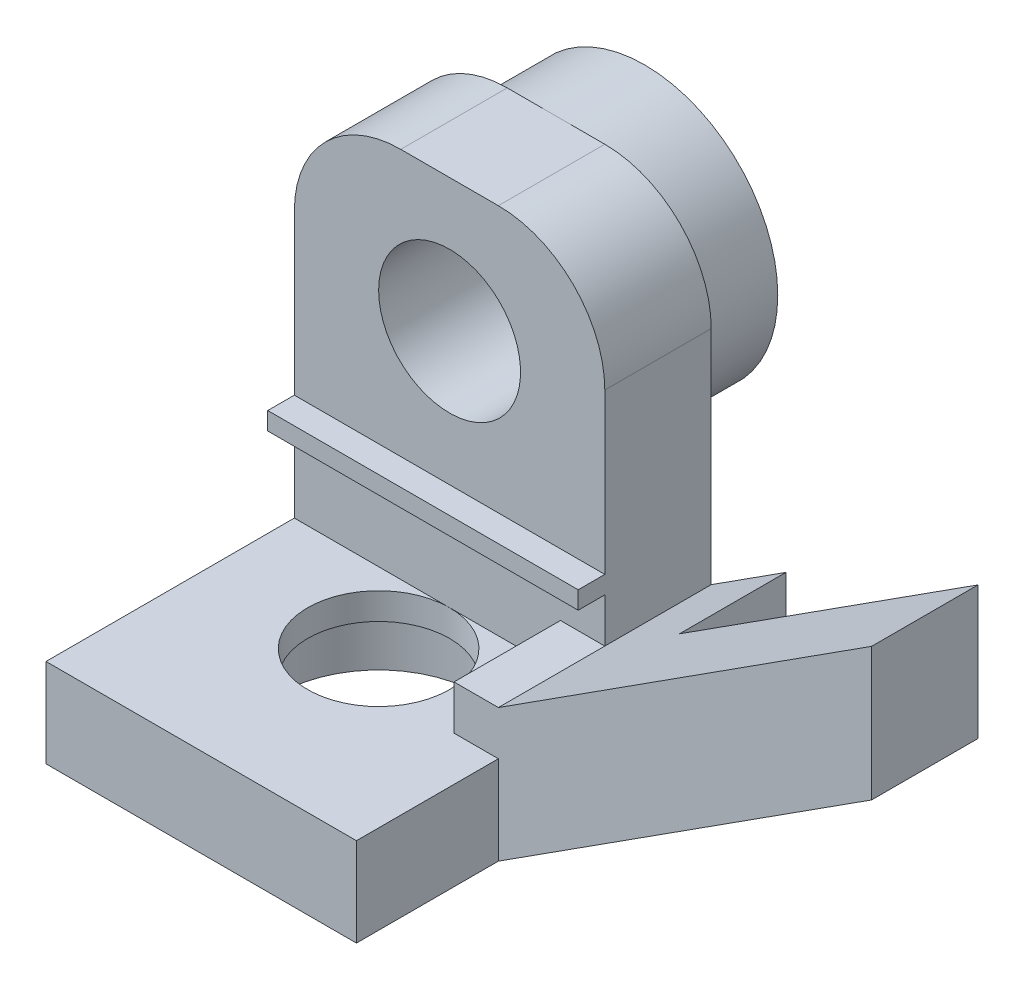
ISO-10303-21;
HEADER;
FILE_DESCRIPTION(('STEP AP214'),'2;1');
FILE_NAME('part.step','',(''),(''),'','','');
FILE_SCHEMA(('AUTOMOTIVE_DESIGN { 1 0 10303 214 1 1 1 1 }'));
ENDSEC;
DATA;
#1=APPLICATION_CONTEXT('core data for automotive mechanical design processes');
#2=APPLICATION_PROTOCOL_DEFINITION('international standard','automotive_design',2000,#1);
#3=PRODUCT_CONTEXT('',#1,'mechanical');
#4=PRODUCT('Part','Part','',(#3));
#5=PRODUCT_RELATED_PRODUCT_CATEGORY('part','',(#4));
#6=PRODUCT_DEFINITION_FORMATION('','',#4);
#7=PRODUCT_DEFINITION_CONTEXT('part definition',#1,'design');
#8=PRODUCT_DEFINITION('design','',#6,#7);
#9=PRODUCT_DEFINITION_SHAPE('','',#8);
#10=(LENGTH_UNIT() NAMED_UNIT(*) SI_UNIT(.MILLI.,.METRE.));
#11=(NAMED_UNIT(*) PLANE_ANGLE_UNIT() SI_UNIT($,.RADIAN.));
#12=(NAMED_UNIT(*) SI_UNIT($,.STERADIAN.) SOLID_ANGLE_UNIT());
#13=UNCERTAINTY_MEASURE_WITH_UNIT(LENGTH_MEASURE(1.E-05),#10,'distance_accuracy_value','');
#14=(GEOMETRIC_REPRESENTATION_CONTEXT(3) GLOBAL_UNCERTAINTY_ASSIGNED_CONTEXT((#13)) GLOBAL_UNIT_ASSIGNED_CONTEXT((#10,
#11,#12)) REPRESENTATION_CONTEXT('',''));
#15=CARTESIAN_POINT('',(0.,0.,0.));
#16=DIRECTION('',(0.,0.,1.));
#17=DIRECTION('',(1.,0.,0.));
#18=AXIS2_PLACEMENT_3D('',#15,#16,#17);
#19=CARTESIAN_POINT('',(-17.5,-12.,6.));
#20=DIRECTION('',(0.,0.,-1.));
#21=DIRECTION('',(-1.,0.,0.));
#22=AXIS2_PLACEMENT_3D('',#19,#20,#21);
#23=PLANE('',#22);
#24=DIRECTION('',(1.,0.,0.));
#25=VECTOR('',#24,1.);
#26=CARTESIAN_POINT('',(12.5,-6.99999999999999,6.));
#27=LINE('',#26,#25);
#28=CARTESIAN_POINT('',(12.5,-6.99999999999999,6.));
#29=VERTEX_POINT('',#28);
#30=CARTESIAN_POINT('',(17.5,-6.99999999999998,6.));
#31=VERTEX_POINT('',#30);
#32=EDGE_CURVE('E513',#29,#31,#27,.T.);
#33=ORIENTED_EDGE('',*,*,#32,.T.);
#34=DIRECTION('',(0.,1.,0.));
#35=VECTOR('',#34,1.);
#36=CARTESIAN_POINT('',(17.5,-12.,6.));
#37=LINE('',#36,#35);
#38=CARTESIAN_POINT('',(17.5,-2.,6.));
#39=VERTEX_POINT('',#38);
#40=EDGE_CURVE('E64',#31,#39,#37,.T.);
#41=ORIENTED_EDGE('',*,*,#40,.T.);
#42=DIRECTION('',(-1.,0.,0.));
#43=VECTOR('',#42,1.);
#44=CARTESIAN_POINT('',(-17.5,-2.,6.));
#45=LINE('',#44,#43);
#46=CARTESIAN_POINT('',(-17.5,-2.,6.));
#47=VERTEX_POINT('',#46);
#48=EDGE_CURVE('E213',#39,#47,#45,.T.);
#49=ORIENTED_EDGE('',*,*,#48,.T.);
#50=DIRECTION('',(0.,1.,0.));
#51=VECTOR('',#50,1.);
#52=CARTESIAN_POINT('',(-17.5,-12.,6.));
#53=LINE('',#52,#51);
#54=CARTESIAN_POINT('',(-17.5,-12.,6.));
#55=VERTEX_POINT('',#54);
#56=EDGE_CURVE('E207',#55,#47,#53,.T.);
#57=ORIENTED_EDGE('',*,*,#56,.F.);
#58=DIRECTION('',(-1.,0.,0.));
#59=VECTOR('',#58,1.);
#60=CARTESIAN_POINT('',(-17.5,-12.,6.));
#61=LINE('',#60,#59);
#62=CARTESIAN_POINT('',(0.,-12.,6.));
#63=VERTEX_POINT('',#62);
#64=EDGE_CURVE('E205',#63,#55,#61,.T.);
#65=ORIENTED_EDGE('',*,*,#64,.F.);
#66=CARTESIAN_POINT('',(12.5,-12.,6.));
#67=VERTEX_POINT('',#66);
#68=EDGE_CURVE('E56',#67,#63,#61,.T.);
#69=ORIENTED_EDGE('',*,*,#68,.F.);
#70=DIRECTION('',(0.,-1.,0.));
#71=VECTOR('',#70,1.);
#72=CARTESIAN_POINT('',(12.5,-6.99999999999999,6.));
#73=LINE('',#72,#71);
#74=EDGE_CURVE('E187',#29,#67,#73,.T.);
#75=ORIENTED_EDGE('',*,*,#74,.F.);
#76=EDGE_LOOP('',(#33,#41,#49,#57,#65,#69,#75));
#77=FACE_BOUND('',#76,.T.);
#78=ADVANCED_FACE('F39',(#77),#23,.F.);
#79=CARTESIAN_POINT('',(0.,-12.,0.));
#80=DIRECTION('',(0.,1.,0.));
#81=DIRECTION('',(0.,0.,1.));
#82=AXIS2_PLACEMENT_3D('',#79,#80,#81);
#83=PLANE('',#82);
#84=DIRECTION('',(0.,0.,1.));
#85=VECTOR('',#84,1.);
#86=CARTESIAN_POINT('',(17.5,-12.,-6.));
#87=LINE('',#86,#85);
#88=CARTESIAN_POINT('',(17.5,-12.,18.));
#89=VERTEX_POINT('',#88);
#90=CARTESIAN_POINT('',(17.5,-12.,34.));
#91=VERTEX_POINT('',#90);
#92=EDGE_CURVE('E404',#89,#91,#87,.T.);
#93=ORIENTED_EDGE('',*,*,#92,.F.);
#94=DIRECTION('',(1.,0.,0.));
#95=VECTOR('',#94,1.);
#96=CARTESIAN_POINT('',(12.5,-12.,18.));
#97=LINE('',#96,#95);
#98=CARTESIAN_POINT('',(12.5,-12.,18.));
#99=VERTEX_POINT('',#98);
#100=EDGE_CURVE('E199',#99,#89,#97,.T.);
#101=ORIENTED_EDGE('',*,*,#100,.F.);
#102=DIRECTION('',(0.,0.,1.));
#103=VECTOR('',#102,1.);
#104=CARTESIAN_POINT('',(12.5,-12.,6.));
#105=LINE('',#104,#103);
#106=EDGE_CURVE('E189',#67,#99,#105,.T.);
#107=ORIENTED_EDGE('',*,*,#106,.F.);
#108=ORIENTED_EDGE('',*,*,#68,.T.);
#109=CARTESIAN_POINT('',(0.,-12.,14.));
#110=DIRECTION('',(0.,-1.,0.));
#111=DIRECTION('',(0.,0.,-1.));
#112=AXIS2_PLACEMENT_3D('',#109,#110,#111);
#113=CIRCLE('',#112,8.);
#114=EDGE_CURVE('E441',#63,#63,#113,.T.);
#115=ORIENTED_EDGE('',*,*,#114,.T.);
#116=ORIENTED_EDGE('',*,*,#64,.T.);
#117=DIRECTION('',(0.,0.,-1.));
#118=VECTOR('',#117,1.);
#119=CARTESIAN_POINT('',(-17.5,-12.,-6.));
#120=LINE('',#119,#118);
#121=CARTESIAN_POINT('',(-17.5,-12.,34.));
#122=VERTEX_POINT('',#121);
#123=EDGE_CURVE('E398',#122,#55,#120,.T.);
#124=ORIENTED_EDGE('',*,*,#123,.F.);
#125=DIRECTION('',(-1.,0.,0.));
#126=VECTOR('',#125,1.);
#127=CARTESIAN_POINT('',(-17.5,-12.,34.));
#128=LINE('',#127,#126);
#129=EDGE_CURVE('E409',#91,#122,#128,.T.);
#130=ORIENTED_EDGE('',*,*,#129,.F.);
#131=EDGE_LOOP('',(#93,#101,#107,#108,#115,#116,#124,#130));
#132=FACE_BOUND('',#131,.T.);
#133=ADVANCED_FACE('F198',(#132),#83,.T.);
#134=CARTESIAN_POINT('',(17.5,20.,-6.));
#135=DIRECTION('',(-1.,0.,0.));
#136=DIRECTION('',(0.,0.,1.));
#137=AXIS2_PLACEMENT_3D('',#134,#135,#136);
#138=PLANE('',#137);
#139=DIRECTION('',(0.,-1.,0.));
#140=VECTOR('',#139,1.);
#141=CARTESIAN_POINT('',(17.5,-22.,18.));
#142=LINE('',#141,#140);
#143=CARTESIAN_POINT('',(17.5,-22.,18.));
#144=VERTEX_POINT('',#143);
#145=EDGE_CURVE('E485',#89,#144,#142,.T.);
#146=ORIENTED_EDGE('',*,*,#145,.F.);
#147=ORIENTED_EDGE('',*,*,#92,.T.);
#148=DIRECTION('',(0.,1.,0.));
#149=VECTOR('',#148,1.);
#150=CARTESIAN_POINT('',(17.5,-22.,34.));
#151=LINE('',#150,#149);
#152=CARTESIAN_POINT('',(17.5,-22.,34.));
#153=VERTEX_POINT('',#152);
#154=EDGE_CURVE('E216',#153,#91,#151,.T.);
#155=ORIENTED_EDGE('',*,*,#154,.F.);
#156=DIRECTION('',(0.,0.,1.));
#157=VECTOR('',#156,1.);
#158=CARTESIAN_POINT('',(17.5,-22.,-6.));
#159=LINE('',#158,#157);
#160=EDGE_CURVE('E429',#144,#153,#159,.T.);
#161=ORIENTED_EDGE('',*,*,#160,.F.);
#162=EDGE_LOOP('',(#146,#147,#155,#161));
#163=FACE_BOUND('',#162,.T.);
#164=ADVANCED_FACE('F364',(#163),#138,.F.);
#165=ORIENTED_EDGE('',*,*,#40,.F.);
#166=DIRECTION('',(0.,0.,-1.));
#167=VECTOR('',#166,1.);
#168=CARTESIAN_POINT('',(17.5,-7.,6.));
#169=LINE('',#168,#167);
#170=CARTESIAN_POINT('',(17.5,-7.,-6.));
#171=VERTEX_POINT('',#170);
#172=EDGE_CURVE('E450',#31,#171,#169,.T.);
#173=ORIENTED_EDGE('',*,*,#172,.T.);
#174=DIRECTION('',(0.,-1.,0.));
#175=VECTOR('',#174,1.);
#176=CARTESIAN_POINT('',(17.5,20.,-6.));
#177=LINE('',#176,#175);
#178=CARTESIAN_POINT('',(17.5,18.,-6.));
#179=VERTEX_POINT('',#178);
#180=EDGE_CURVE('E293',#179,#171,#177,.T.);
#181=ORIENTED_EDGE('',*,*,#180,.F.);
#182=DIRECTION('',(0.,0.,-1.));
#183=VECTOR('',#182,1.);
#184=CARTESIAN_POINT('',(17.5,18.,6.));
#185=LINE('',#184,#183);
#186=CARTESIAN_POINT('',(17.5,18.,6.));
#187=VERTEX_POINT('',#186);
#188=EDGE_CURVE('E43',#179,#187,#185,.F.);
#189=ORIENTED_EDGE('',*,*,#188,.T.);
#190=DIRECTION('',(0.,-1.,0.));
#191=VECTOR('',#190,1.);
#192=CARTESIAN_POINT('',(17.5,20.,6.));
#193=LINE('',#192,#191);
#194=CARTESIAN_POINT('',(17.5,0.,6.));
#195=VERTEX_POINT('',#194);
#196=EDGE_CURVE('E282',#187,#195,#193,.T.);
#197=ORIENTED_EDGE('',*,*,#196,.T.);
#198=DIRECTION('',(0.,0.,1.));
#199=VECTOR('',#198,1.);
#200=CARTESIAN_POINT('',(17.5,0.,-6.));
#201=LINE('',#200,#199);
#202=CARTESIAN_POINT('',(17.5,0.,9.));
#203=VERTEX_POINT('',#202);
#204=EDGE_CURVE('E237',#195,#203,#201,.T.);
#205=ORIENTED_EDGE('',*,*,#204,.T.);
#206=DIRECTION('',(0.,1.,0.));
#207=VECTOR('',#206,1.);
#208=CARTESIAN_POINT('',(17.5,-2.,9.));
#209=LINE('',#208,#207);
#210=CARTESIAN_POINT('',(17.5,-2.,9.));
#211=VERTEX_POINT('',#210);
#212=EDGE_CURVE('E245',#211,#203,#209,.T.);
#213=ORIENTED_EDGE('',*,*,#212,.F.);
#214=DIRECTION('',(0.,0.,1.));
#215=VECTOR('',#214,1.);
#216=CARTESIAN_POINT('',(17.5,-2.,-6.));
#217=LINE('',#216,#215);
#218=EDGE_CURVE('E226',#39,#211,#217,.T.);
#219=ORIENTED_EDGE('',*,*,#218,.F.);
#220=EDGE_LOOP('',(#165,#173,#181,#189,#197,#205,#213,#219));
#221=FACE_BOUND('',#220,.T.);
#222=ADVANCED_FACE('F329',(#221),#138,.F.);
#223=CARTESIAN_POINT('',(0.,-2.,0.));
#224=DIRECTION('',(0.,1.,0.));
#225=DIRECTION('',(0.,0.,1.));
#226=AXIS2_PLACEMENT_3D('',#223,#224,#225);
#227=PLANE('',#226);
#228=ORIENTED_EDGE('',*,*,#48,.F.);
#229=ORIENTED_EDGE('',*,*,#218,.T.);
#230=DIRECTION('',(-1.,0.,0.));
#231=VECTOR('',#230,1.);
#232=CARTESIAN_POINT('',(-17.5,-2.,9.));
#233=LINE('',#232,#231);
#234=CARTESIAN_POINT('',(-17.5,-2.,9.));
#235=VERTEX_POINT('',#234);
#236=EDGE_CURVE('E230',#211,#235,#233,.T.);
#237=ORIENTED_EDGE('',*,*,#236,.T.);
#238=DIRECTION('',(0.,0.,-1.));
#239=VECTOR('',#238,1.);
#240=CARTESIAN_POINT('',(-17.5,-2.,-6.));
#241=LINE('',#240,#239);
#242=EDGE_CURVE('E223',#235,#47,#241,.T.);
#243=ORIENTED_EDGE('',*,*,#242,.T.);
#244=EDGE_LOOP('',(#228,#229,#237,#243));
#245=FACE_BOUND('',#244,.T.);
#246=ADVANCED_FACE('F369',(#245),#227,.F.);
#247=CARTESIAN_POINT('',(-17.5,20.,-6.));
#248=DIRECTION('',(0.,0.,1.));
#249=DIRECTION('',(1.,0.,0.));
#250=AXIS2_PLACEMENT_3D('',#247,#248,#249);
#251=PLANE('',#250);
#252=CARTESIAN_POINT('',(0.,15.,-6.));
#253=DIRECTION('',(0.,0.,-1.));
#254=DIRECTION('',(-1.,0.,0.));
#255=AXIS2_PLACEMENT_3D('',#252,#253,#254);
#256=CIRCLE('',#255,8.);
#257=CARTESIAN_POINT('',(-8.00000000000001,15.,-6.));
#258=VERTEX_POINT('',#257);
#259=EDGE_CURVE('E260',#258,#258,#256,.T.);
#260=ORIENTED_EDGE('',*,*,#259,.F.);
#261=EDGE_LOOP('',(#260));
#262=FACE_BOUND('',#261,.T.);
#263=CARTESIAN_POINT('',(0.,15.,-6.));
#264=DIRECTION('',(0.,0.,-1.));
#265=DIRECTION('',(-1.,0.,0.));
#266=AXIS2_PLACEMENT_3D('',#263,#264,#265);
#267=CIRCLE('',#266,12.);
#268=CARTESIAN_POINT('',(-12.,15.,-6.));
#269=VERTEX_POINT('',#268);
#270=EDGE_CURVE('E249',#269,#269,#267,.T.);
#271=ORIENTED_EDGE('',*,*,#270,.T.);
#272=EDGE_LOOP('',(#271));
#273=FACE_BOUND('',#272,.T.);
#274=ADVANCED_FACE('F372',(#262,#273),#251,.F.);
#275=CARTESIAN_POINT('',(0.,15.,-6.));
#276=DIRECTION('',(0.,0.,-1.));
#277=DIRECTION('',(-1.,0.,0.));
#278=AXIS2_PLACEMENT_3D('',#275,#276,#277);
#279=CIRCLE('',#278,15.);
#280=CARTESIAN_POINT('',(0.,30.,-6.));
#281=VERTEX_POINT('',#280);
#282=EDGE_CURVE('E11',#281,#281,#279,.T.);
#283=ORIENTED_EDGE('',*,*,#282,.F.);
#284=DIRECTION('',(-1.,0.,0.));
#285=VECTOR('',#284,1.);
#286=CARTESIAN_POINT('',(-17.5,30.,-6.));
#287=LINE('',#286,#285);
#288=CARTESIAN_POINT('',(5.49999999999999,30.,-6.));
#289=VERTEX_POINT('',#288);
#290=EDGE_CURVE('E274',#289,#281,#287,.T.);
#291=ORIENTED_EDGE('',*,*,#290,.F.);
#292=CARTESIAN_POINT('',(5.49999999999999,18.,-6.));
#293=DIRECTION('',(0.,0.,1.));
#294=DIRECTION('',(1.,0.,0.));
#295=AXIS2_PLACEMENT_3D('',#292,#293,#294);
#296=CIRCLE('',#295,12.);
#297=EDGE_CURVE('E314',#289,#179,#296,.F.);
#298=ORIENTED_EDGE('',*,*,#297,.T.);
#299=ORIENTED_EDGE('',*,*,#180,.T.);
#300=DIRECTION('',(0.84151078194531,0.54024032047765,0.));
#301=VECTOR('',#300,1.);
#302=CARTESIAN_POINT('',(25.9151078194531,-1.5975967952235,-6.));
#303=LINE('',#302,#301);
#304=CARTESIAN_POINT('',(25.9151078194531,-1.5975967952235,-6.));
#305=VERTEX_POINT('',#304);
#306=EDGE_CURVE('E467',#171,#305,#303,.T.);
#307=ORIENTED_EDGE('',*,*,#306,.T.);
#308=DIRECTION('',(0.,-1.,0.));
#309=VECTOR('',#308,1.);
#310=CARTESIAN_POINT('',(25.9151078194531,-16.5975967952235,-6.));
#311=LINE('',#310,#309);
#312=CARTESIAN_POINT('',(25.9151078194531,-16.5975967952235,-6.));
#313=VERTEX_POINT('',#312);
#314=EDGE_CURVE('E463',#305,#313,#311,.T.);
#315=ORIENTED_EDGE('',*,*,#314,.T.);
#316=DIRECTION('',(-0.841510781945309,-0.54024032047765,0.));
#317=VECTOR('',#316,1.);
#318=CARTESIAN_POINT('',(17.5,-22.,-6.));
#319=LINE('',#318,#317);
#320=CARTESIAN_POINT('',(17.5,-22.,-6.));
#321=VERTEX_POINT('',#320);
#322=EDGE_CURVE('E459',#313,#321,#319,.T.);
#323=ORIENTED_EDGE('',*,*,#322,.T.);
#324=DIRECTION('',(1.,0.,0.));
#325=VECTOR('',#324,1.);
#326=CARTESIAN_POINT('',(-17.5,-22.,-6.));
#327=LINE('',#326,#325);
#328=CARTESIAN_POINT('',(-17.5,-22.,-6.));
#329=VERTEX_POINT('',#328);
#330=EDGE_CURVE('E433',#329,#321,#327,.T.);
#331=ORIENTED_EDGE('',*,*,#330,.F.);
#332=DIRECTION('',(0.,-1.,0.));
#333=VECTOR('',#332,1.);
#334=CARTESIAN_POINT('',(-17.5,20.,-6.));
#335=LINE('',#334,#333);
#336=CARTESIAN_POINT('',(-17.5,18.,-6.));
#337=VERTEX_POINT('',#336);
#338=EDGE_CURVE('E290',#337,#329,#335,.T.);
#339=ORIENTED_EDGE('',*,*,#338,.F.);
#340=CARTESIAN_POINT('',(-5.50000000000001,18.,-6.));
#341=DIRECTION('',(0.,0.,1.));
#342=DIRECTION('',(1.,0.,0.));
#343=AXIS2_PLACEMENT_3D('',#340,#341,#342);
#344=CIRCLE('',#343,12.);
#345=CARTESIAN_POINT('',(-5.50000000000001,30.,-6.));
#346=VERTEX_POINT('',#345);
#347=EDGE_CURVE('E316',#337,#346,#344,.F.);
#348=ORIENTED_EDGE('',*,*,#347,.T.);
#349=EDGE_CURVE('E273',#281,#346,#287,.T.);
#350=ORIENTED_EDGE('',*,*,#349,.F.);
#351=EDGE_LOOP('',(#283,#291,#298,#299,#307,#315,#323,#331,#339,#348,#350));
#352=FACE_BOUND('',#351,.T.);
#353=ADVANCED_FACE('F340',(#352),#251,.F.);
#354=CARTESIAN_POINT('',(-17.5,20.,-6.));
#355=DIRECTION('',(1.,0.,0.));
#356=DIRECTION('',(0.,0.,-1.));
#357=AXIS2_PLACEMENT_3D('',#354,#355,#356);
#358=PLANE('',#357);
#359=DIRECTION('',(0.,-1.,0.));
#360=VECTOR('',#359,1.);
#361=CARTESIAN_POINT('',(-17.5,20.,6.));
#362=LINE('',#361,#360);
#363=CARTESIAN_POINT('',(-17.5,18.,6.));
#364=VERTEX_POINT('',#363);
#365=CARTESIAN_POINT('',(-17.5,0.,6.));
#366=VERTEX_POINT('',#365);
#367=EDGE_CURVE('E286',#364,#366,#362,.T.);
#368=ORIENTED_EDGE('',*,*,#367,.F.);
#369=DIRECTION('',(0.,0.,1.));
#370=VECTOR('',#369,1.);
#371=CARTESIAN_POINT('',(-17.5,18.,-6.));
#372=LINE('',#371,#370);
#373=EDGE_CURVE('E311',#364,#337,#372,.F.);
#374=ORIENTED_EDGE('',*,*,#373,.T.);
#375=ORIENTED_EDGE('',*,*,#338,.T.);
#376=DIRECTION('',(0.,0.,-1.));
#377=VECTOR('',#376,1.);
#378=CARTESIAN_POINT('',(-17.5,-22.,-6.));
#379=LINE('',#378,#377);
#380=CARTESIAN_POINT('',(-17.5,-22.,34.));
#381=VERTEX_POINT('',#380);
#382=EDGE_CURVE('E419',#381,#329,#379,.T.);
#383=ORIENTED_EDGE('',*,*,#382,.F.);
#384=DIRECTION('',(0.,1.,0.));
#385=VECTOR('',#384,1.);
#386=CARTESIAN_POINT('',(-17.5,-22.,34.));
#387=LINE('',#386,#385);
#388=EDGE_CURVE('E401',#381,#122,#387,.T.);
#389=ORIENTED_EDGE('',*,*,#388,.T.);
#390=ORIENTED_EDGE('',*,*,#123,.T.);
#391=ORIENTED_EDGE('',*,*,#56,.T.);
#392=ORIENTED_EDGE('',*,*,#242,.F.);
#393=DIRECTION('',(0.,1.,0.));
#394=VECTOR('',#393,1.);
#395=CARTESIAN_POINT('',(-17.5,-2.,9.));
#396=LINE('',#395,#394);
#397=CARTESIAN_POINT('',(-17.5,0.,9.));
#398=VERTEX_POINT('',#397);
#399=EDGE_CURVE('E233',#235,#398,#396,.T.);
#400=ORIENTED_EDGE('',*,*,#399,.T.);
#401=DIRECTION('',(0.,0.,-1.));
#402=VECTOR('',#401,1.);
#403=CARTESIAN_POINT('',(-17.5,0.,-6.));
#404=LINE('',#403,#402);
#405=EDGE_CURVE('E222',#398,#366,#404,.T.);
#406=ORIENTED_EDGE('',*,*,#405,.T.);
#407=EDGE_LOOP('',(#368,#374,#375,#383,#389,#390,#391,#392,#400,#406));
#408=FACE_BOUND('',#407,.T.);
#409=ADVANCED_FACE('F393',(#408),#358,.F.);
#410=CARTESIAN_POINT('',(-17.5,20.,6.));
#411=DIRECTION('',(0.,0.,-1.));
#412=DIRECTION('',(-1.,0.,0.));
#413=AXIS2_PLACEMENT_3D('',#410,#411,#412);
#414=PLANE('',#413);
#415=CARTESIAN_POINT('',(0.,15.,6.));
#416=DIRECTION('',(0.,0.,-1.));
#417=DIRECTION('',(-1.,0.,0.));
#418=AXIS2_PLACEMENT_3D('',#415,#416,#417);
#419=CIRCLE('',#418,8.);
#420=CARTESIAN_POINT('',(-8.00000000000001,15.,6.));
#421=VERTEX_POINT('',#420);
#422=EDGE_CURVE('E262',#421,#421,#419,.T.);
#423=ORIENTED_EDGE('',*,*,#422,.T.);
#424=EDGE_LOOP('',(#423));
#425=FACE_BOUND('',#424,.T.);
#426=DIRECTION('',(1.,0.,0.));
#427=VECTOR('',#426,1.);
#428=CARTESIAN_POINT('',(-17.5,30.,6.));
#429=LINE('',#428,#427);
#430=CARTESIAN_POINT('',(-5.5,30.,6.));
#431=VERTEX_POINT('',#430);
#432=CARTESIAN_POINT('',(5.49999999999999,30.,6.));
#433=VERTEX_POINT('',#432);
#434=EDGE_CURVE('E266',#431,#433,#429,.T.);
#435=ORIENTED_EDGE('',*,*,#434,.F.);
#436=CARTESIAN_POINT('',(-5.5,18.,6.));
#437=DIRECTION('',(0.,0.,-1.));
#438=DIRECTION('',(-1.,0.,0.));
#439=AXIS2_PLACEMENT_3D('',#436,#437,#438);
#440=CIRCLE('',#439,12.);
#441=EDGE_CURVE('E308',#431,#364,#440,.F.);
#442=ORIENTED_EDGE('',*,*,#441,.T.);
#443=ORIENTED_EDGE('',*,*,#367,.T.);
#444=DIRECTION('',(1.,0.,0.));
#445=VECTOR('',#444,1.);
#446=CARTESIAN_POINT('',(-17.5,0.,6.));
#447=LINE('',#446,#445);
#448=EDGE_CURVE('E278',#366,#195,#447,.T.);
#449=ORIENTED_EDGE('',*,*,#448,.T.);
#450=ORIENTED_EDGE('',*,*,#196,.F.);
#451=CARTESIAN_POINT('',(5.49999999999999,18.,6.));
#452=DIRECTION('',(0.,0.,-1.));
#453=DIRECTION('',(-1.,0.,0.));
#454=AXIS2_PLACEMENT_3D('',#451,#452,#453);
#455=CIRCLE('',#454,12.);
#456=EDGE_CURVE('E305',#187,#433,#455,.F.);
#457=ORIENTED_EDGE('',*,*,#456,.T.);
#458=EDGE_LOOP('',(#435,#442,#443,#449,#450,#457));
#459=FACE_BOUND('',#458,.T.);
#460=ADVANCED_FACE('F335',(#425,#459),#414,.F.);
#461=CARTESIAN_POINT('',(0.,30.,0.));
#462=DIRECTION('',(0.,1.,0.));
#463=DIRECTION('',(0.,0.,1.));
#464=AXIS2_PLACEMENT_3D('',#461,#462,#463);
#465=PLANE('',#464);
#466=ORIENTED_EDGE('',*,*,#290,.T.);
#467=ORIENTED_EDGE('',*,*,#349,.T.);
#468=DIRECTION('',(0.,0.,1.));
#469=VECTOR('',#468,1.);
#470=CARTESIAN_POINT('',(-5.5,30.,5.99999999999999));
#471=LINE('',#470,#469);
#472=EDGE_CURVE('E301',#346,#431,#471,.T.);
#473=ORIENTED_EDGE('',*,*,#472,.T.);
#474=ORIENTED_EDGE('',*,*,#434,.T.);
#475=DIRECTION('',(0.,0.,-1.));
#476=VECTOR('',#475,1.);
#477=CARTESIAN_POINT('',(5.49999999999999,30.,-6.));
#478=LINE('',#477,#476);
#479=EDGE_CURVE('E297',#433,#289,#478,.T.);
#480=ORIENTED_EDGE('',*,*,#479,.T.);
#481=EDGE_LOOP('',(#466,#467,#473,#474,#480));
#482=FACE_BOUND('',#481,.T.);
#483=ADVANCED_FACE('F339',(#482),#465,.T.);
#484=CARTESIAN_POINT('',(0.,15.,6.));
#485=DIRECTION('',(0.,0.,-1.));
#486=DIRECTION('',(-1.,0.,0.));
#487=AXIS2_PLACEMENT_3D('',#484,#485,#486);
#488=CYLINDRICAL_SURFACE('',#487,8.);
#489=ORIENTED_EDGE('',*,*,#422,.F.);
#490=EDGE_LOOP('',(#489));
#491=FACE_BOUND('',#490,.T.);
#492=ORIENTED_EDGE('',*,*,#259,.T.);
#493=EDGE_LOOP('',(#492));
#494=FACE_BOUND('',#493,.T.);
#495=ADVANCED_FACE('F703',(#491,#494),#488,.F.);
#496=CARTESIAN_POINT('',(-5.5,18.,0.));
#497=DIRECTION('',(0.,0.,-1.));
#498=DIRECTION('',(-1.,0.,0.));
#499=AXIS2_PLACEMENT_3D('',#496,#497,#498);
#500=CYLINDRICAL_SURFACE('',#499,12.);
#501=ORIENTED_EDGE('',*,*,#347,.F.);
#502=ORIENTED_EDGE('',*,*,#373,.F.);
#503=ORIENTED_EDGE('',*,*,#441,.F.);
#504=ORIENTED_EDGE('',*,*,#472,.F.);
#505=EDGE_LOOP('',(#501,#502,#503,#504));
#506=FACE_BOUND('',#505,.T.);
#507=ADVANCED_FACE('F721',(#506),#500,.T.);
#508=CARTESIAN_POINT('',(5.49999999999999,18.,0.));
#509=DIRECTION('',(0.,0.,1.));
#510=DIRECTION('',(1.,0.,0.));
#511=AXIS2_PLACEMENT_3D('',#508,#509,#510);
#512=CYLINDRICAL_SURFACE('',#511,12.);
#513=ORIENTED_EDGE('',*,*,#456,.F.);
#514=ORIENTED_EDGE('',*,*,#188,.F.);
#515=ORIENTED_EDGE('',*,*,#297,.F.);
#516=ORIENTED_EDGE('',*,*,#479,.F.);
#517=EDGE_LOOP('',(#513,#514,#515,#516));
#518=FACE_BOUND('',#517,.T.);
#519=ADVANCED_FACE('F41',(#518),#512,.T.);
#520=CARTESIAN_POINT('',(0.,15.,-16.));
#521=DIRECTION('',(0.,0.,-1.));
#522=DIRECTION('',(-1.,0.,0.));
#523=AXIS2_PLACEMENT_3D('',#520,#521,#522);
#524=PLANE('',#523);
#525=CARTESIAN_POINT('',(0.,15.,-16.));
#526=DIRECTION('',(0.,0.,-1.));
#527=DIRECTION('',(-1.,0.,0.));
#528=AXIS2_PLACEMENT_3D('',#525,#526,#527);
#529=CIRCLE('',#528,15.);
#530=CARTESIAN_POINT('',(-15.,15.,-16.));
#531=VERTEX_POINT('',#530);
#532=EDGE_CURVE('E254',#531,#531,#529,.T.);
#533=ORIENTED_EDGE('',*,*,#532,.T.);
#534=EDGE_LOOP('',(#533));
#535=FACE_BOUND('',#534,.T.);
#536=CARTESIAN_POINT('',(0.,15.,-16.));
#537=DIRECTION('',(0.,0.,-1.));
#538=DIRECTION('',(-1.,0.,0.));
#539=AXIS2_PLACEMENT_3D('',#536,#537,#538);
#540=CIRCLE('',#539,12.);
#541=CARTESIAN_POINT('',(-12.,15.,-16.));
#542=VERTEX_POINT('',#541);
#543=EDGE_CURVE('E250',#542,#542,#540,.T.);
#544=ORIENTED_EDGE('',*,*,#543,.F.);
#545=EDGE_LOOP('',(#544));
#546=FACE_BOUND('',#545,.T.);
#547=ADVANCED_FACE('F345',(#535,#546),#524,.T.);
#548=CARTESIAN_POINT('',(0.,15.,-16.));
#549=DIRECTION('',(0.,0.,1.));
#550=DIRECTION('',(1.,0.,0.));
#551=AXIS2_PLACEMENT_3D('',#548,#549,#550);
#552=CYLINDRICAL_SURFACE('',#551,15.);
#553=ORIENTED_EDGE('',*,*,#532,.F.);
#554=EDGE_LOOP('',(#553));
#555=FACE_BOUND('',#554,.T.);
#556=ORIENTED_EDGE('',*,*,#282,.T.);
#557=EDGE_LOOP('',(#556));
#558=FACE_BOUND('',#557,.T.);
#559=ADVANCED_FACE('F342',(#555,#558),#552,.T.);
#560=CARTESIAN_POINT('',(0.,15.,-16.));
#561=DIRECTION('',(0.,0.,1.));
#562=DIRECTION('',(1.,0.,0.));
#563=AXIS2_PLACEMENT_3D('',#560,#561,#562);
#564=CYLINDRICAL_SURFACE('',#563,12.);
#565=ORIENTED_EDGE('',*,*,#543,.T.);
#566=EDGE_LOOP('',(#565));
#567=FACE_BOUND('',#566,.T.);
#568=ORIENTED_EDGE('',*,*,#270,.F.);
#569=EDGE_LOOP('',(#568));
#570=FACE_BOUND('',#569,.T.);
#571=ADVANCED_FACE('F344',(#567,#570),#564,.F.);
#572=CARTESIAN_POINT('',(0.,0.,0.));
#573=DIRECTION('',(0.,1.,0.));
#574=DIRECTION('',(0.,0.,1.));
#575=AXIS2_PLACEMENT_3D('',#572,#573,#574);
#576=PLANE('',#575);
#577=ORIENTED_EDGE('',*,*,#448,.F.);
#578=ORIENTED_EDGE('',*,*,#405,.F.);
#579=DIRECTION('',(-1.,0.,0.));
#580=VECTOR('',#579,1.);
#581=CARTESIAN_POINT('',(-17.5,0.,9.));
#582=LINE('',#581,#580);
#583=EDGE_CURVE('E227',#203,#398,#582,.T.);
#584=ORIENTED_EDGE('',*,*,#583,.F.);
#585=ORIENTED_EDGE('',*,*,#204,.F.);
#586=EDGE_LOOP('',(#577,#578,#584,#585));
#587=FACE_BOUND('',#586,.T.);
#588=ADVANCED_FACE('F352',(#587),#576,.T.);
#589=CARTESIAN_POINT('',(-17.5,-2.,9.));
#590=DIRECTION('',(0.,0.,-1.));
#591=DIRECTION('',(-1.,0.,0.));
#592=AXIS2_PLACEMENT_3D('',#589,#590,#591);
#593=PLANE('',#592);
#594=ORIENTED_EDGE('',*,*,#583,.T.);
#595=ORIENTED_EDGE('',*,*,#399,.F.);
#596=ORIENTED_EDGE('',*,*,#236,.F.);
#597=ORIENTED_EDGE('',*,*,#212,.T.);
#598=EDGE_LOOP('',(#594,#595,#596,#597));
#599=FACE_BOUND('',#598,.T.);
#600=ADVANCED_FACE('F376',(#599),#593,.F.);
#601=CARTESIAN_POINT('',(-17.5,-22.,34.));
#602=DIRECTION('',(0.,0.,-1.));
#603=DIRECTION('',(-1.,0.,0.));
#604=AXIS2_PLACEMENT_3D('',#601,#602,#603);
#605=PLANE('',#604);
#606=ORIENTED_EDGE('',*,*,#129,.T.);
#607=ORIENTED_EDGE('',*,*,#388,.F.);
#608=DIRECTION('',(-1.,0.,0.));
#609=VECTOR('',#608,1.);
#610=CARTESIAN_POINT('',(-17.5,-22.,34.));
#611=LINE('',#610,#609);
#612=EDGE_CURVE('E415',#153,#381,#611,.T.);
#613=ORIENTED_EDGE('',*,*,#612,.F.);
#614=ORIENTED_EDGE('',*,*,#154,.T.);
#615=EDGE_LOOP('',(#606,#607,#613,#614));
#616=FACE_BOUND('',#615,.T.);
#617=ADVANCED_FACE('F368',(#616),#605,.F.);
#618=CARTESIAN_POINT('',(0.,-22.,0.));
#619=DIRECTION('',(0.,1.,0.));
#620=DIRECTION('',(0.,0.,1.));
#621=AXIS2_PLACEMENT_3D('',#618,#619,#620);
#622=PLANE('',#621);
#623=CARTESIAN_POINT('',(0.,-22.,14.));
#624=DIRECTION('',(0.,-1.,0.));
#625=DIRECTION('',(0.,0.,-1.));
#626=AXIS2_PLACEMENT_3D('',#623,#624,#625);
#627=CIRCLE('',#626,11.2);
#628=CARTESIAN_POINT('',(0.,-22.,2.8));
#629=VERTEX_POINT('',#628);
#630=EDGE_CURVE('E412',#629,#629,#627,.T.);
#631=ORIENTED_EDGE('',*,*,#630,.F.);
#632=EDGE_LOOP('',(#631));
#633=FACE_BOUND('',#632,.T.);
#634=ORIENTED_EDGE('',*,*,#382,.T.);
#635=ORIENTED_EDGE('',*,*,#330,.T.);
#636=EDGE_CURVE('E424',#321,#144,#159,.T.);
#637=ORIENTED_EDGE('',*,*,#636,.T.);
#638=ORIENTED_EDGE('',*,*,#160,.T.);
#639=ORIENTED_EDGE('',*,*,#612,.T.);
#640=EDGE_LOOP('',(#634,#635,#637,#638,#639));
#641=FACE_BOUND('',#640,.T.);
#642=ADVANCED_FACE('F383',(#633,#641),#622,.F.);
#643=CARTESIAN_POINT('',(0.,-15.,14.));
#644=DIRECTION('',(0.,-1.,0.));
#645=DIRECTION('',(0.,0.,-1.));
#646=AXIS2_PLACEMENT_3D('',#643,#644,#645);
#647=CYLINDRICAL_SURFACE('',#646,11.2);
#648=CARTESIAN_POINT('',(0.,-15.,14.));
#649=DIRECTION('',(0.,-1.,0.));
#650=DIRECTION('',(0.,0.,-1.));
#651=AXIS2_PLACEMENT_3D('',#648,#649,#650);
#652=CIRCLE('',#651,11.2);
#653=CARTESIAN_POINT('',(0.,-15.,2.8));
#654=VERTEX_POINT('',#653);
#655=EDGE_CURVE('E405',#654,#654,#652,.T.);
#656=ORIENTED_EDGE('',*,*,#655,.F.);
#657=EDGE_LOOP('',(#656));
#658=FACE_BOUND('',#657,.T.);
#659=ORIENTED_EDGE('',*,*,#630,.T.);
#660=EDGE_LOOP('',(#659));
#661=FACE_BOUND('',#660,.T.);
#662=ADVANCED_FACE('F544',(#658,#661),#647,.F.);
#663=CARTESIAN_POINT('',(0.,-15.,14.));
#664=DIRECTION('',(0.,-1.,0.));
#665=DIRECTION('',(0.,0.,-1.));
#666=AXIS2_PLACEMENT_3D('',#663,#664,#665);
#667=PLANE('',#666);
#668=CARTESIAN_POINT('',(0.,-15.,14.));
#669=DIRECTION('',(0.,-1.,0.));
#670=DIRECTION('',(0.,0.,-1.));
#671=AXIS2_PLACEMENT_3D('',#668,#669,#670);
#672=CIRCLE('',#671,8.);
#673=CARTESIAN_POINT('',(0.,-15.,6.));
#674=VERTEX_POINT('',#673);
#675=EDGE_CURVE('E443',#674,#674,#672,.T.);
#676=ORIENTED_EDGE('',*,*,#675,.F.);
#677=EDGE_LOOP('',(#676));
#678=FACE_BOUND('',#677,.T.);
#679=ORIENTED_EDGE('',*,*,#655,.T.);
#680=EDGE_LOOP('',(#679));
#681=FACE_BOUND('',#680,.T.);
#682=ADVANCED_FACE('F550',(#678,#681),#667,.T.);
#683=CARTESIAN_POINT('',(0.,-12.,14.));
#684=DIRECTION('',(0.,-1.,0.));
#685=DIRECTION('',(0.,0.,-1.));
#686=AXIS2_PLACEMENT_3D('',#683,#684,#685);
#687=CYLINDRICAL_SURFACE('',#686,8.);
#688=ORIENTED_EDGE('',*,*,#114,.F.);
#689=EDGE_LOOP('',(#688));
#690=FACE_BOUND('',#689,.T.);
#691=ORIENTED_EDGE('',*,*,#675,.T.);
#692=EDGE_LOOP('',(#691));
#693=FACE_BOUND('',#692,.T.);
#694=ADVANCED_FACE('F557',(#690,#693),#687,.F.);
#695=CARTESIAN_POINT('',(17.5,-22.,6.));
#696=DIRECTION('',(0.54024032047765,-0.841510781945309,0.));
#697=DIRECTION('',(0.84151078194531,0.54024032047765,0.));
#698=AXIS2_PLACEMENT_3D('',#695,#696,#697);
#699=PLANE('',#698);
#700=ORIENTED_EDGE('',*,*,#322,.F.);
#701=DIRECTION('',(0.,0.,-1.));
#702=VECTOR('',#701,1.);
#703=CARTESIAN_POINT('',(25.9151078194531,-16.5975967952235,6.));
#704=LINE('',#703,#702);
#705=CARTESIAN_POINT('',(25.9151078194531,-16.5975967952234,6.));
#706=VERTEX_POINT('',#705);
#707=EDGE_CURVE('E447',#706,#313,#704,.T.);
#708=ORIENTED_EDGE('',*,*,#707,.F.);
#709=DIRECTION('',(0.841510781945305,0.540240320477657,0.));
#710=VECTOR('',#709,1.);
#711=CARTESIAN_POINT('',(17.5,-22.,6.));
#712=LINE('',#711,#710);
#713=CARTESIAN_POINT('',(59.5755390972652,5.01201602388284,6.));
#714=VERTEX_POINT('',#713);
#715=EDGE_CURVE('E493',#706,#714,#712,.T.);
#716=ORIENTED_EDGE('',*,*,#715,.T.);
#717=DIRECTION('',(0.,0.,-1.));
#718=VECTOR('',#717,1.);
#719=CARTESIAN_POINT('',(59.5755390972652,5.01201602388284,18.));
#720=LINE('',#719,#718);
#721=CARTESIAN_POINT('',(59.5755390972652,5.01201602388284,18.));
#722=VERTEX_POINT('',#721);
#723=EDGE_CURVE('E471',#722,#714,#720,.T.);
#724=ORIENTED_EDGE('',*,*,#723,.F.);
#725=DIRECTION('',(0.841510781945305,0.540240320477657,0.));
#726=VECTOR('',#725,1.);
#727=CARTESIAN_POINT('',(17.5,-22.,18.));
#728=LINE('',#727,#726);
#729=EDGE_CURVE('E489',#144,#722,#728,.T.);
#730=ORIENTED_EDGE('',*,*,#729,.F.);
#731=ORIENTED_EDGE('',*,*,#636,.F.);
#732=EDGE_LOOP('',(#700,#708,#716,#724,#730,#731));
#733=FACE_BOUND('',#732,.T.);
#734=ADVANCED_FACE('F536',(#733),#699,.T.);
#735=CARTESIAN_POINT('',(25.9151078194531,-16.5975967952235,6.));
#736=DIRECTION('',(1.,0.,0.));
#737=DIRECTION('',(0.,0.,-1.));
#738=AXIS2_PLACEMENT_3D('',#735,#736,#737);
#739=PLANE('',#738);
#740=ORIENTED_EDGE('',*,*,#314,.F.);
#741=DIRECTION('',(0.,0.,-1.));
#742=VECTOR('',#741,1.);
#743=CARTESIAN_POINT('',(25.9151078194531,-1.5975967952235,6.));
#744=LINE('',#743,#742);
#745=CARTESIAN_POINT('',(25.9151078194531,-1.5975967952235,6.));
#746=VERTEX_POINT('',#745);
#747=EDGE_CURVE('E453',#746,#305,#744,.T.);
#748=ORIENTED_EDGE('',*,*,#747,.F.);
#749=DIRECTION('',(0.,-1.,0.));
#750=VECTOR('',#749,1.);
#751=CARTESIAN_POINT('',(25.9151078194531,-16.5975967952235,6.));
#752=LINE('',#751,#750);
#753=EDGE_CURVE('E454',#746,#706,#752,.T.);
#754=ORIENTED_EDGE('',*,*,#753,.T.);
#755=ORIENTED_EDGE('',*,*,#707,.T.);
#756=EDGE_LOOP('',(#740,#748,#754,#755));
#757=FACE_BOUND('',#756,.T.);
#758=ADVANCED_FACE('F565',(#757),#739,.T.);
#759=CARTESIAN_POINT('',(25.9151078194531,-1.5975967952235,6.));
#760=DIRECTION('',(-0.54024032047765,0.84151078194531,0.));
#761=DIRECTION('',(-0.84151078194531,-0.54024032047765,0.));
#762=AXIS2_PLACEMENT_3D('',#759,#760,#761);
#763=PLANE('',#762);
#764=ORIENTED_EDGE('',*,*,#306,.F.);
#765=ORIENTED_EDGE('',*,*,#172,.F.);
#766=DIRECTION('',(0.,0.,-1.));
#767=VECTOR('',#766,1.);
#768=CARTESIAN_POINT('',(17.5,-7.,18.));
#769=LINE('',#768,#767);
#770=CARTESIAN_POINT('',(17.5,-6.99999999999998,18.));
#771=VERTEX_POINT('',#770);
#772=EDGE_CURVE('E482',#771,#31,#769,.T.);
#773=ORIENTED_EDGE('',*,*,#772,.F.);
#774=DIRECTION('',(-0.841510781945305,-0.540240320477657,0.));
#775=VECTOR('',#774,1.);
#776=CARTESIAN_POINT('',(17.5,-7.,18.));
#777=LINE('',#776,#775);
#778=CARTESIAN_POINT('',(59.5755390972652,20.0120160238828,18.));
#779=VERTEX_POINT('',#778);
#780=EDGE_CURVE('E498',#779,#771,#777,.T.);
#781=ORIENTED_EDGE('',*,*,#780,.F.);
#782=DIRECTION('',(0.,0.,-1.));
#783=VECTOR('',#782,1.);
#784=CARTESIAN_POINT('',(59.5755390972652,20.0120160238828,18.));
#785=LINE('',#784,#783);
#786=CARTESIAN_POINT('',(59.5755390972652,20.0120160238828,6.));
#787=VERTEX_POINT('',#786);
#788=EDGE_CURVE('E478',#779,#787,#785,.T.);
#789=ORIENTED_EDGE('',*,*,#788,.T.);
#790=DIRECTION('',(-0.841510781945305,-0.540240320477657,0.));
#791=VECTOR('',#790,1.);
#792=CARTESIAN_POINT('',(17.5,-7.,6.));
#793=LINE('',#792,#791);
#794=EDGE_CURVE('E486',#787,#746,#793,.T.);
#795=ORIENTED_EDGE('',*,*,#794,.T.);
#796=ORIENTED_EDGE('',*,*,#747,.T.);
#797=EDGE_LOOP('',(#764,#765,#773,#781,#789,#795,#796));
#798=FACE_BOUND('',#797,.T.);
#799=ADVANCED_FACE('F528',(#798),#763,.T.);
#800=CARTESIAN_POINT('',(59.5755390972652,20.0120160238828,18.));
#801=DIRECTION('',(-1.,0.,0.));
#802=DIRECTION('',(0.,0.,1.));
#803=AXIS2_PLACEMENT_3D('',#800,#801,#802);
#804=PLANE('',#803);
#805=DIRECTION('',(0.,1.,0.));
#806=VECTOR('',#805,1.);
#807=CARTESIAN_POINT('',(59.5755390972652,20.0120160238828,6.));
#808=LINE('',#807,#806);
#809=EDGE_CURVE('E490',#714,#787,#808,.T.);
#810=ORIENTED_EDGE('',*,*,#809,.T.);
#811=ORIENTED_EDGE('',*,*,#788,.F.);
#812=DIRECTION('',(0.,1.,0.));
#813=VECTOR('',#812,1.);
#814=CARTESIAN_POINT('',(59.5755390972652,20.0120160238828,18.));
#815=LINE('',#814,#813);
#816=EDGE_CURVE('E502',#722,#779,#815,.T.);
#817=ORIENTED_EDGE('',*,*,#816,.F.);
#818=ORIENTED_EDGE('',*,*,#723,.T.);
#819=EDGE_LOOP('',(#810,#811,#817,#818));
#820=FACE_BOUND('',#819,.T.);
#821=ADVANCED_FACE('F564',(#820),#804,.F.);
#822=CARTESIAN_POINT('',(0.,0.,18.));
#823=DIRECTION('',(0.,0.,-1.));
#824=DIRECTION('',(-1.,0.,0.));
#825=AXIS2_PLACEMENT_3D('',#822,#823,#824);
#826=PLANE('',#825);
#827=ORIENTED_EDGE('',*,*,#729,.T.);
#828=ORIENTED_EDGE('',*,*,#816,.T.);
#829=ORIENTED_EDGE('',*,*,#780,.T.);
#830=DIRECTION('',(1.,0.,0.));
#831=VECTOR('',#830,1.);
#832=CARTESIAN_POINT('',(12.5,-6.99999999999999,18.));
#833=LINE('',#832,#831);
#834=CARTESIAN_POINT('',(12.5,-6.99999999999999,18.));
#835=VERTEX_POINT('',#834);
#836=EDGE_CURVE('E510',#835,#771,#833,.T.);
#837=ORIENTED_EDGE('',*,*,#836,.F.);
#838=DIRECTION('',(0.,1.,0.));
#839=VECTOR('',#838,1.);
#840=CARTESIAN_POINT('',(12.5,-6.99999999999999,18.));
#841=LINE('',#840,#839);
#842=EDGE_CURVE('E201',#99,#835,#841,.T.);
#843=ORIENTED_EDGE('',*,*,#842,.F.);
#844=ORIENTED_EDGE('',*,*,#100,.T.);
#845=ORIENTED_EDGE('',*,*,#145,.T.);
#846=EDGE_LOOP('',(#827,#828,#829,#837,#843,#844,#845));
#847=FACE_BOUND('',#846,.T.);
#848=ADVANCED_FACE('F521',(#847),#826,.F.);
#849=CARTESIAN_POINT('',(0.,0.,6.));
#850=DIRECTION('',(0.,0.,-1.));
#851=DIRECTION('',(-1.,0.,0.));
#852=AXIS2_PLACEMENT_3D('',#849,#850,#851);
#853=PLANE('',#852);
#854=ORIENTED_EDGE('',*,*,#715,.F.);
#855=ORIENTED_EDGE('',*,*,#753,.F.);
#856=ORIENTED_EDGE('',*,*,#794,.F.);
#857=ORIENTED_EDGE('',*,*,#809,.F.);
#858=EDGE_LOOP('',(#854,#855,#856,#857));
#859=FACE_BOUND('',#858,.T.);
#860=ADVANCED_FACE('F573',(#859),#853,.T.);
#861=CARTESIAN_POINT('',(12.5,-6.99999999999999,6.));
#862=DIRECTION('',(0.,-1.,0.));
#863=DIRECTION('',(1.,0.,0.));
#864=AXIS2_PLACEMENT_3D('',#861,#862,#863);
#865=PLANE('',#864);
#866=ORIENTED_EDGE('',*,*,#772,.T.);
#867=ORIENTED_EDGE('',*,*,#32,.F.);
#868=DIRECTION('',(0.,0.,-1.));
#869=VECTOR('',#868,1.);
#870=CARTESIAN_POINT('',(12.5,-6.99999999999999,6.));
#871=LINE('',#870,#869);
#872=EDGE_CURVE('E192',#835,#29,#871,.T.);
#873=ORIENTED_EDGE('',*,*,#872,.F.);
#874=ORIENTED_EDGE('',*,*,#836,.T.);
#875=EDGE_LOOP('',(#866,#867,#873,#874));
#876=FACE_BOUND('',#875,.T.);
#877=ADVANCED_FACE('F525',(#876),#865,.F.);
#878=CARTESIAN_POINT('',(12.5,0.,0.));
#879=DIRECTION('',(-1.,0.,0.));
#880=DIRECTION('',(0.,-1.,0.));
#881=AXIS2_PLACEMENT_3D('',#878,#879,#880);
#882=PLANE('',#881);
#883=ORIENTED_EDGE('',*,*,#74,.T.);
#884=ORIENTED_EDGE('',*,*,#106,.T.);
#885=ORIENTED_EDGE('',*,*,#842,.T.);
#886=ORIENTED_EDGE('',*,*,#872,.T.);
#887=EDGE_LOOP('',(#883,#884,#885,#886));
#888=FACE_BOUND('',#887,.T.);
#889=ADVANCED_FACE('F188',(#888),#882,.T.);
#890=CLOSED_SHELL('',(#78,#133,#164,#222,#246,#274,#353,#409,#460,#483,#495,#507,#519,#547,#559,
#571,#588,#600,#617,#642,#662,#682,#694,#734,#758,#799,#821,#848,#860,#877,#889));
#891=MANIFOLD_SOLID_BREP('B2',#890);
#892=ADVANCED_BREP_SHAPE_REPRESENTATION('',(#18,#891),#14);
#893=SHAPE_DEFINITION_REPRESENTATION(#9,#892);
ENDSEC;
END-ISO-10303-21;
